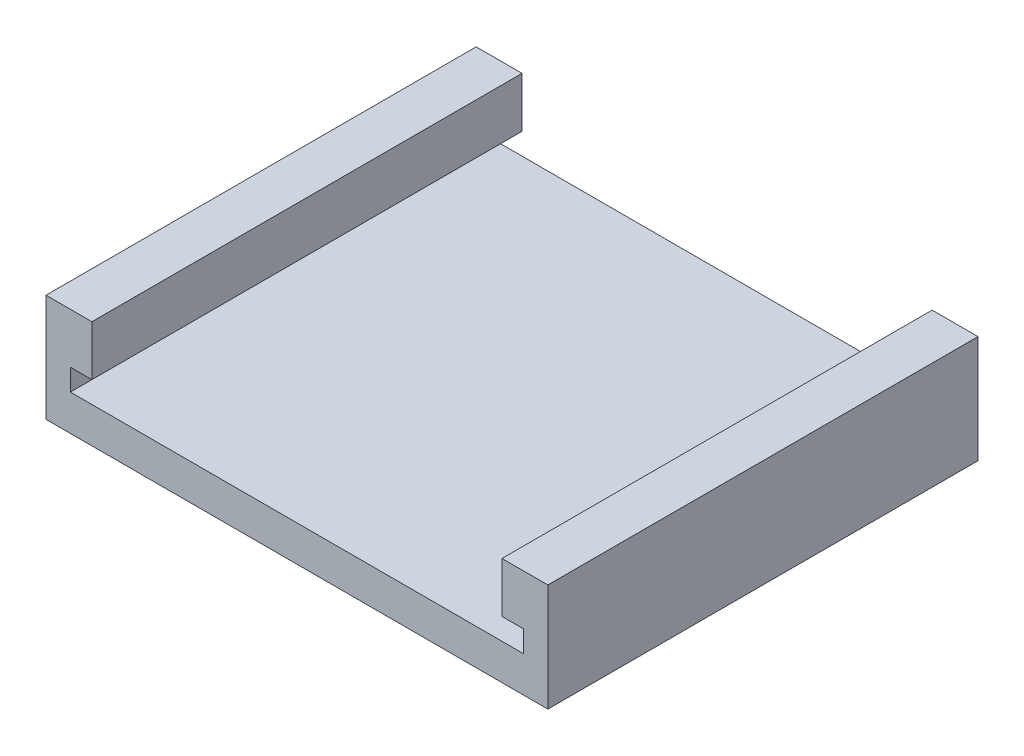
ISO-10303-21;
HEADER;
FILE_DESCRIPTION(('STEP AP214'),'2;1');
FILE_NAME('part.step','',(''),(''),'','','');
FILE_SCHEMA(('AUTOMOTIVE_DESIGN { 1 0 10303 214 1 1 1 1 }'));
ENDSEC;
DATA;
#1=APPLICATION_CONTEXT('core data for automotive mechanical design processes');
#2=APPLICATION_PROTOCOL_DEFINITION('international standard','automotive_design',2000,#1);
#3=PRODUCT_CONTEXT('',#1,'mechanical');
#4=PRODUCT('Part','Part','',(#3));
#5=PRODUCT_RELATED_PRODUCT_CATEGORY('part','',(#4));
#6=PRODUCT_DEFINITION_FORMATION('','',#4);
#7=PRODUCT_DEFINITION_CONTEXT('part definition',#1,'design');
#8=PRODUCT_DEFINITION('design','',#6,#7);
#9=PRODUCT_DEFINITION_SHAPE('','',#8);
#10=(LENGTH_UNIT() NAMED_UNIT(*) SI_UNIT(.MILLI.,.METRE.));
#11=(NAMED_UNIT(*) PLANE_ANGLE_UNIT() SI_UNIT($,.RADIAN.));
#12=(NAMED_UNIT(*) SI_UNIT($,.STERADIAN.) SOLID_ANGLE_UNIT());
#13=UNCERTAINTY_MEASURE_WITH_UNIT(LENGTH_MEASURE(1.E-05),#10,'distance_accuracy_value','');
#14=(GEOMETRIC_REPRESENTATION_CONTEXT(3) GLOBAL_UNCERTAINTY_ASSIGNED_CONTEXT((#13)) GLOBAL_UNIT_ASSIGNED_CONTEXT((#10,
#11,#12)) REPRESENTATION_CONTEXT('',''));
#15=CARTESIAN_POINT('',(0.,0.,0.));
#16=DIRECTION('',(0.,0.,1.));
#17=DIRECTION('',(1.,0.,0.));
#18=AXIS2_PLACEMENT_3D('',#15,#16,#17);
#19=CARTESIAN_POINT('',(31.6,15.,0.));
#20=DIRECTION('',(1.,0.,0.));
#21=DIRECTION('',(0.,0.,-1.));
#22=AXIS2_PLACEMENT_3D('',#19,#20,#21);
#23=PLANE('',#22);
#24=DIRECTION('',(0.,0.,1.));
#25=VECTOR('',#24,1.);
#26=CARTESIAN_POINT('',(31.6,8.,-30.));
#27=LINE('',#26,#25);
#28=CARTESIAN_POINT('',(31.6,8.,-30.));
#29=VERTEX_POINT('',#28);
#30=CARTESIAN_POINT('',(31.6,8.,30.));
#31=VERTEX_POINT('',#30);
#32=EDGE_CURVE('E144',#29,#31,#27,.T.);
#33=ORIENTED_EDGE('',*,*,#32,.F.);
#34=DIRECTION('',(0.,-1.,0.));
#35=VECTOR('',#34,1.);
#36=CARTESIAN_POINT('',(31.6,15.,-30.));
#37=LINE('',#36,#35);
#38=CARTESIAN_POINT('',(31.6,5.,-30.));
#39=VERTEX_POINT('',#38);
#40=EDGE_CURVE('E149',#29,#39,#37,.T.);
#41=ORIENTED_EDGE('',*,*,#40,.T.);
#42=DIRECTION('',(0.,0.,1.));
#43=VECTOR('',#42,1.);
#44=CARTESIAN_POINT('',(31.6,5.,0.));
#45=LINE('',#44,#43);
#46=CARTESIAN_POINT('',(31.6,5.,30.));
#47=VERTEX_POINT('',#46);
#48=EDGE_CURVE('E172',#39,#47,#45,.T.);
#49=ORIENTED_EDGE('',*,*,#48,.T.);
#50=DIRECTION('',(0.,-1.,0.));
#51=VECTOR('',#50,1.);
#52=CARTESIAN_POINT('',(31.6,15.,30.));
#53=LINE('',#52,#51);
#54=EDGE_CURVE('E181',#31,#47,#53,.T.);
#55=ORIENTED_EDGE('',*,*,#54,.F.);
#56=EDGE_LOOP('',(#33,#41,#49,#55));
#57=FACE_BOUND('',#56,.T.);
#58=ADVANCED_FACE('F37',(#57),#23,.F.);
#59=CARTESIAN_POINT('',(-31.6,15.,0.));
#60=DIRECTION('',(1.,0.,0.));
#61=DIRECTION('',(0.,0.,-1.));
#62=AXIS2_PLACEMENT_3D('',#59,#60,#61);
#63=PLANE('',#62);
#64=DIRECTION('',(0.,-1.,0.));
#65=VECTOR('',#64,1.);
#66=CARTESIAN_POINT('',(-31.6,15.,-30.));
#67=LINE('',#66,#65);
#68=CARTESIAN_POINT('',(-31.6,8.,-30.));
#69=VERTEX_POINT('',#68);
#70=CARTESIAN_POINT('',(-31.6,5.,-30.));
#71=VERTEX_POINT('',#70);
#72=EDGE_CURVE('E57',#69,#71,#67,.T.);
#73=ORIENTED_EDGE('',*,*,#72,.F.);
#74=DIRECTION('',(0.,0.,-1.));
#75=VECTOR('',#74,1.);
#76=CARTESIAN_POINT('',(-31.6,8.,30.));
#77=LINE('',#76,#75);
#78=CARTESIAN_POINT('',(-31.6,8.,30.));
#79=VERTEX_POINT('',#78);
#80=EDGE_CURVE('E52',#79,#69,#77,.T.);
#81=ORIENTED_EDGE('',*,*,#80,.F.);
#82=DIRECTION('',(0.,-1.,0.));
#83=VECTOR('',#82,1.);
#84=CARTESIAN_POINT('',(-31.6,15.,30.));
#85=LINE('',#84,#83);
#86=CARTESIAN_POINT('',(-31.6,5.,30.));
#87=VERTEX_POINT('',#86);
#88=EDGE_CURVE('E195',#79,#87,#85,.T.);
#89=ORIENTED_EDGE('',*,*,#88,.T.);
#90=DIRECTION('',(0.,0.,1.));
#91=VECTOR('',#90,1.);
#92=CARTESIAN_POINT('',(-31.6,5.,0.));
#93=LINE('',#92,#91);
#94=EDGE_CURVE('E186',#71,#87,#93,.T.);
#95=ORIENTED_EDGE('',*,*,#94,.F.);
#96=EDGE_LOOP('',(#73,#81,#89,#95));
#97=FACE_BOUND('',#96,.T.);
#98=ADVANCED_FACE('F256',(#97),#63,.T.);
#99=CARTESIAN_POINT('',(0.,5.,0.));
#100=DIRECTION('',(0.,1.,0.));
#101=DIRECTION('',(0.,0.,1.));
#102=AXIS2_PLACEMENT_3D('',#99,#100,#101);
#103=PLANE('',#102);
#104=DIRECTION('',(1.,0.,0.));
#105=VECTOR('',#104,1.);
#106=CARTESIAN_POINT('',(35.,5.,30.));
#107=LINE('',#106,#105);
#108=EDGE_CURVE('E201',#87,#47,#107,.T.);
#109=ORIENTED_EDGE('',*,*,#108,.T.);
#110=ORIENTED_EDGE('',*,*,#48,.F.);
#111=DIRECTION('',(-1.,0.,0.));
#112=VECTOR('',#111,1.);
#113=CARTESIAN_POINT('',(35.,5.,-30.));
#114=LINE('',#113,#112);
#115=EDGE_CURVE('E204',#39,#71,#114,.T.);
#116=ORIENTED_EDGE('',*,*,#115,.T.);
#117=ORIENTED_EDGE('',*,*,#94,.T.);
#118=EDGE_LOOP('',(#109,#110,#116,#117));
#119=FACE_BOUND('',#118,.T.);
#120=ADVANCED_FACE('F262',(#119),#103,.T.);
#121=CARTESIAN_POINT('',(-35.,5.,30.));
#122=DIRECTION('',(1.,0.,0.));
#123=DIRECTION('',(0.,0.,-1.));
#124=AXIS2_PLACEMENT_3D('',#121,#122,#123);
#125=PLANE('',#124);
#126=DIRECTION('',(0.,0.,1.));
#127=VECTOR('',#126,1.);
#128=CARTESIAN_POINT('',(-35.,0.,30.));
#129=LINE('',#128,#127);
#130=CARTESIAN_POINT('',(-35.,0.,-30.));
#131=VERTEX_POINT('',#130);
#132=CARTESIAN_POINT('',(-35.,0.,30.));
#133=VERTEX_POINT('',#132);
#134=EDGE_CURVE('E200',#131,#133,#129,.T.);
#135=ORIENTED_EDGE('',*,*,#134,.T.);
#136=DIRECTION('',(0.,-1.,0.));
#137=VECTOR('',#136,1.);
#138=CARTESIAN_POINT('',(-35.,5.,30.));
#139=LINE('',#138,#137);
#140=CARTESIAN_POINT('',(-35.,15.,30.));
#141=VERTEX_POINT('',#140);
#142=EDGE_CURVE('E11',#141,#133,#139,.T.);
#143=ORIENTED_EDGE('',*,*,#142,.F.);
#144=DIRECTION('',(0.,0.,1.));
#145=VECTOR('',#144,1.);
#146=CARTESIAN_POINT('',(-35.,15.,0.));
#147=LINE('',#146,#145);
#148=CARTESIAN_POINT('',(-35.,15.,-30.));
#149=VERTEX_POINT('',#148);
#150=EDGE_CURVE('E190',#149,#141,#147,.T.);
#151=ORIENTED_EDGE('',*,*,#150,.F.);
#152=DIRECTION('',(0.,-1.,0.));
#153=VECTOR('',#152,1.);
#154=CARTESIAN_POINT('',(-35.,5.,-30.));
#155=LINE('',#154,#153);
#156=EDGE_CURVE('E208',#149,#131,#155,.T.);
#157=ORIENTED_EDGE('',*,*,#156,.T.);
#158=EDGE_LOOP('',(#135,#143,#151,#157));
#159=FACE_BOUND('',#158,.T.);
#160=ADVANCED_FACE('F39',(#159),#125,.F.);
#161=CARTESIAN_POINT('',(35.,5.,30.));
#162=DIRECTION('',(0.,0.,-1.));
#163=DIRECTION('',(-1.,0.,0.));
#164=AXIS2_PLACEMENT_3D('',#161,#162,#163);
#165=PLANE('',#164);
#166=DIRECTION('',(1.,0.,0.));
#167=VECTOR('',#166,1.);
#168=CARTESIAN_POINT('',(35.,0.,30.));
#169=LINE('',#168,#167);
#170=CARTESIAN_POINT('',(35.,0.,30.));
#171=VERTEX_POINT('',#170);
#172=EDGE_CURVE('E211',#133,#171,#169,.T.);
#173=ORIENTED_EDGE('',*,*,#172,.T.);
#174=DIRECTION('',(0.,-1.,0.));
#175=VECTOR('',#174,1.);
#176=CARTESIAN_POINT('',(35.,5.,30.));
#177=LINE('',#176,#175);
#178=CARTESIAN_POINT('',(35.,15.,30.));
#179=VERTEX_POINT('',#178);
#180=EDGE_CURVE('E45',#179,#171,#177,.T.);
#181=ORIENTED_EDGE('',*,*,#180,.F.);
#182=DIRECTION('',(1.,0.,0.));
#183=VECTOR('',#182,1.);
#184=CARTESIAN_POINT('',(0.,15.,30.));
#185=LINE('',#184,#183);
#186=CARTESIAN_POINT('',(28.6,15.,30.));
#187=VERTEX_POINT('',#186);
#188=EDGE_CURVE('E175',#187,#179,#185,.T.);
#189=ORIENTED_EDGE('',*,*,#188,.F.);
#190=DIRECTION('',(0.,1.,0.));
#191=VECTOR('',#190,1.);
#192=CARTESIAN_POINT('',(28.6,15.,30.));
#193=LINE('',#192,#191);
#194=CARTESIAN_POINT('',(28.6,8.,30.));
#195=VERTEX_POINT('',#194);
#196=EDGE_CURVE('E134',#195,#187,#193,.T.);
#197=ORIENTED_EDGE('',*,*,#196,.F.);
#198=DIRECTION('',(1.,0.,0.));
#199=VECTOR('',#198,1.);
#200=CARTESIAN_POINT('',(28.6,8.,30.));
#201=LINE('',#200,#199);
#202=EDGE_CURVE('E130',#195,#31,#201,.T.);
#203=ORIENTED_EDGE('',*,*,#202,.T.);
#204=ORIENTED_EDGE('',*,*,#54,.T.);
#205=ORIENTED_EDGE('',*,*,#108,.F.);
#206=ORIENTED_EDGE('',*,*,#88,.F.);
#207=DIRECTION('',(-1.,0.,0.));
#208=VECTOR('',#207,1.);
#209=CARTESIAN_POINT('',(-28.6,8.,30.));
#210=LINE('',#209,#208);
#211=CARTESIAN_POINT('',(-28.6,8.,30.));
#212=VERTEX_POINT('',#211);
#213=EDGE_CURVE('E169',#212,#79,#210,.T.);
#214=ORIENTED_EDGE('',*,*,#213,.F.);
#215=DIRECTION('',(0.,-1.,0.));
#216=VECTOR('',#215,1.);
#217=CARTESIAN_POINT('',(-28.6,15.,30.));
#218=LINE('',#217,#216);
#219=CARTESIAN_POINT('',(-28.6,15.,30.));
#220=VERTEX_POINT('',#219);
#221=EDGE_CURVE('E151',#220,#212,#218,.T.);
#222=ORIENTED_EDGE('',*,*,#221,.F.);
#223=DIRECTION('',(1.,0.,0.));
#224=VECTOR('',#223,1.);
#225=CARTESIAN_POINT('',(0.,15.,30.));
#226=LINE('',#225,#224);
#227=EDGE_CURVE('E193',#141,#220,#226,.T.);
#228=ORIENTED_EDGE('',*,*,#227,.F.);
#229=ORIENTED_EDGE('',*,*,#142,.T.);
#230=EDGE_LOOP('',(#173,#181,#189,#197,#203,#204,#205,#206,#214,#222,#228,#229));
#231=FACE_BOUND('',#230,.T.);
#232=ADVANCED_FACE('F237',(#231),#165,.F.);
#233=CARTESIAN_POINT('',(35.,5.,30.));
#234=DIRECTION('',(-1.,0.,0.));
#235=DIRECTION('',(0.,0.,1.));
#236=AXIS2_PLACEMENT_3D('',#233,#234,#235);
#237=PLANE('',#236);
#238=DIRECTION('',(0.,0.,-1.));
#239=VECTOR('',#238,1.);
#240=CARTESIAN_POINT('',(35.,0.,30.));
#241=LINE('',#240,#239);
#242=CARTESIAN_POINT('',(35.,0.,-30.));
#243=VERTEX_POINT('',#242);
#244=EDGE_CURVE('E213',#171,#243,#241,.T.);
#245=ORIENTED_EDGE('',*,*,#244,.T.);
#246=DIRECTION('',(0.,-1.,0.));
#247=VECTOR('',#246,1.);
#248=CARTESIAN_POINT('',(35.,5.,-30.));
#249=LINE('',#248,#247);
#250=CARTESIAN_POINT('',(35.,15.,-30.));
#251=VERTEX_POINT('',#250);
#252=EDGE_CURVE('E218',#251,#243,#249,.T.);
#253=ORIENTED_EDGE('',*,*,#252,.F.);
#254=DIRECTION('',(0.,0.,-1.));
#255=VECTOR('',#254,1.);
#256=CARTESIAN_POINT('',(35.,15.,0.));
#257=LINE('',#256,#255);
#258=EDGE_CURVE('E178',#179,#251,#257,.T.);
#259=ORIENTED_EDGE('',*,*,#258,.F.);
#260=ORIENTED_EDGE('',*,*,#180,.T.);
#261=EDGE_LOOP('',(#245,#253,#259,#260));
#262=FACE_BOUND('',#261,.T.);
#263=ADVANCED_FACE('F224',(#262),#237,.F.);
#264=CARTESIAN_POINT('',(35.,5.,-30.));
#265=DIRECTION('',(0.,0.,1.));
#266=DIRECTION('',(1.,0.,0.));
#267=AXIS2_PLACEMENT_3D('',#264,#265,#266);
#268=PLANE('',#267);
#269=DIRECTION('',(-1.,0.,0.));
#270=VECTOR('',#269,1.);
#271=CARTESIAN_POINT('',(35.,0.,-30.));
#272=LINE('',#271,#270);
#273=EDGE_CURVE('E205',#243,#131,#272,.T.);
#274=ORIENTED_EDGE('',*,*,#273,.T.);
#275=ORIENTED_EDGE('',*,*,#156,.F.);
#276=DIRECTION('',(-1.,0.,0.));
#277=VECTOR('',#276,1.);
#278=CARTESIAN_POINT('',(0.,15.,-30.));
#279=LINE('',#278,#277);
#280=CARTESIAN_POINT('',(-28.6,15.,-30.));
#281=VERTEX_POINT('',#280);
#282=EDGE_CURVE('E187',#281,#149,#279,.T.);
#283=ORIENTED_EDGE('',*,*,#282,.F.);
#284=DIRECTION('',(0.,1.,0.));
#285=VECTOR('',#284,1.);
#286=CARTESIAN_POINT('',(-28.6,15.,-30.));
#287=LINE('',#286,#285);
#288=CARTESIAN_POINT('',(-28.6,8.,-30.));
#289=VERTEX_POINT('',#288);
#290=EDGE_CURVE('E160',#289,#281,#287,.T.);
#291=ORIENTED_EDGE('',*,*,#290,.F.);
#292=DIRECTION('',(-1.,0.,0.));
#293=VECTOR('',#292,1.);
#294=CARTESIAN_POINT('',(-28.6,8.,-30.));
#295=LINE('',#294,#293);
#296=EDGE_CURVE('E165',#289,#69,#295,.T.);
#297=ORIENTED_EDGE('',*,*,#296,.T.);
#298=ORIENTED_EDGE('',*,*,#72,.T.);
#299=ORIENTED_EDGE('',*,*,#115,.F.);
#300=ORIENTED_EDGE('',*,*,#40,.F.);
#301=DIRECTION('',(1.,0.,0.));
#302=VECTOR('',#301,1.);
#303=CARTESIAN_POINT('',(28.6,8.,-30.));
#304=LINE('',#303,#302);
#305=CARTESIAN_POINT('',(28.6,8.,-30.));
#306=VERTEX_POINT('',#305);
#307=EDGE_CURVE('E127',#306,#29,#304,.T.);
#308=ORIENTED_EDGE('',*,*,#307,.F.);
#309=DIRECTION('',(0.,-1.,0.));
#310=VECTOR('',#309,1.);
#311=CARTESIAN_POINT('',(28.6,15.,-30.));
#312=LINE('',#311,#310);
#313=CARTESIAN_POINT('',(28.6,15.,-30.));
#314=VERTEX_POINT('',#313);
#315=EDGE_CURVE('E135',#314,#306,#312,.T.);
#316=ORIENTED_EDGE('',*,*,#315,.F.);
#317=DIRECTION('',(-1.,0.,0.));
#318=VECTOR('',#317,1.);
#319=CARTESIAN_POINT('',(0.,15.,-30.));
#320=LINE('',#319,#318);
#321=EDGE_CURVE('E173',#251,#314,#320,.T.);
#322=ORIENTED_EDGE('',*,*,#321,.F.);
#323=ORIENTED_EDGE('',*,*,#252,.T.);
#324=EDGE_LOOP('',(#274,#275,#283,#291,#297,#298,#299,#300,#308,#316,#322,#323));
#325=FACE_BOUND('',#324,.T.);
#326=ADVANCED_FACE('F147',(#325),#268,.F.);
#327=CARTESIAN_POINT('',(0.,0.,0.));
#328=DIRECTION('',(0.,1.,0.));
#329=DIRECTION('',(0.,0.,1.));
#330=AXIS2_PLACEMENT_3D('',#327,#328,#329);
#331=PLANE('',#330);
#332=ORIENTED_EDGE('',*,*,#134,.F.);
#333=ORIENTED_EDGE('',*,*,#273,.F.);
#334=ORIENTED_EDGE('',*,*,#244,.F.);
#335=ORIENTED_EDGE('',*,*,#172,.F.);
#336=EDGE_LOOP('',(#332,#333,#334,#335));
#337=FACE_BOUND('',#336,.T.);
#338=ADVANCED_FACE('F229',(#337),#331,.F.);
#339=CARTESIAN_POINT('',(0.,15.,0.));
#340=DIRECTION('',(0.,1.,0.));
#341=DIRECTION('',(0.,0.,1.));
#342=AXIS2_PLACEMENT_3D('',#339,#340,#341);
#343=PLANE('',#342);
#344=ORIENTED_EDGE('',*,*,#227,.T.);
#345=DIRECTION('',(0.,0.,1.));
#346=VECTOR('',#345,1.);
#347=CARTESIAN_POINT('',(-28.6,15.,30.));
#348=LINE('',#347,#346);
#349=EDGE_CURVE('E163',#281,#220,#348,.T.);
#350=ORIENTED_EDGE('',*,*,#349,.F.);
#351=ORIENTED_EDGE('',*,*,#282,.T.);
#352=ORIENTED_EDGE('',*,*,#150,.T.);
#353=EDGE_LOOP('',(#344,#350,#351,#352));
#354=FACE_BOUND('',#353,.T.);
#355=ADVANCED_FACE('F234',(#354),#343,.T.);
#356=CARTESIAN_POINT('',(0.,15.,0.));
#357=DIRECTION('',(0.,1.,0.));
#358=DIRECTION('',(0.,0.,1.));
#359=AXIS2_PLACEMENT_3D('',#356,#357,#358);
#360=PLANE('',#359);
#361=ORIENTED_EDGE('',*,*,#321,.T.);
#362=DIRECTION('',(0.,0.,-1.));
#363=VECTOR('',#362,1.);
#364=CARTESIAN_POINT('',(28.6,15.,-30.));
#365=LINE('',#364,#363);
#366=EDGE_CURVE('E141',#187,#314,#365,.T.);
#367=ORIENTED_EDGE('',*,*,#366,.F.);
#368=ORIENTED_EDGE('',*,*,#188,.T.);
#369=ORIENTED_EDGE('',*,*,#258,.T.);
#370=EDGE_LOOP('',(#361,#367,#368,#369));
#371=FACE_BOUND('',#370,.T.);
#372=ADVANCED_FACE('F246',(#371),#360,.T.);
#373=CARTESIAN_POINT('',(-28.6,8.,30.));
#374=DIRECTION('',(0.,1.,0.));
#375=DIRECTION('',(0.,0.,1.));
#376=AXIS2_PLACEMENT_3D('',#373,#374,#375);
#377=PLANE('',#376);
#378=ORIENTED_EDGE('',*,*,#80,.T.);
#379=ORIENTED_EDGE('',*,*,#296,.F.);
#380=DIRECTION('',(0.,0.,-1.));
#381=VECTOR('',#380,1.);
#382=CARTESIAN_POINT('',(-28.6,8.,30.));
#383=LINE('',#382,#381);
#384=EDGE_CURVE('E158',#212,#289,#383,.T.);
#385=ORIENTED_EDGE('',*,*,#384,.F.);
#386=ORIENTED_EDGE('',*,*,#213,.T.);
#387=EDGE_LOOP('',(#378,#379,#385,#386));
#388=FACE_BOUND('',#387,.T.);
#389=ADVANCED_FACE('F244',(#388),#377,.F.);
#390=CARTESIAN_POINT('',(-28.6,0.,0.));
#391=DIRECTION('',(1.,0.,0.));
#392=DIRECTION('',(0.,0.,-1.));
#393=AXIS2_PLACEMENT_3D('',#390,#391,#392);
#394=PLANE('',#393);
#395=ORIENTED_EDGE('',*,*,#221,.T.);
#396=ORIENTED_EDGE('',*,*,#384,.T.);
#397=ORIENTED_EDGE('',*,*,#290,.T.);
#398=ORIENTED_EDGE('',*,*,#349,.T.);
#399=EDGE_LOOP('',(#395,#396,#397,#398));
#400=FACE_BOUND('',#399,.T.);
#401=ADVANCED_FACE('F240',(#400),#394,.T.);
#402=CARTESIAN_POINT('',(28.6,8.,-30.));
#403=DIRECTION('',(0.,1.,0.));
#404=DIRECTION('',(0.,0.,1.));
#405=AXIS2_PLACEMENT_3D('',#402,#403,#404);
#406=PLANE('',#405);
#407=ORIENTED_EDGE('',*,*,#32,.T.);
#408=ORIENTED_EDGE('',*,*,#202,.F.);
#409=DIRECTION('',(0.,0.,1.));
#410=VECTOR('',#409,1.);
#411=CARTESIAN_POINT('',(28.6,8.,-30.));
#412=LINE('',#411,#410);
#413=EDGE_CURVE('E123',#306,#195,#412,.T.);
#414=ORIENTED_EDGE('',*,*,#413,.F.);
#415=ORIENTED_EDGE('',*,*,#307,.T.);
#416=EDGE_LOOP('',(#407,#408,#414,#415));
#417=FACE_BOUND('',#416,.T.);
#418=ADVANCED_FACE('F125',(#417),#406,.F.);
#419=CARTESIAN_POINT('',(28.6,0.,0.));
#420=DIRECTION('',(-1.,0.,0.));
#421=DIRECTION('',(0.,0.,1.));
#422=AXIS2_PLACEMENT_3D('',#419,#420,#421);
#423=PLANE('',#422);
#424=ORIENTED_EDGE('',*,*,#315,.T.);
#425=ORIENTED_EDGE('',*,*,#413,.T.);
#426=ORIENTED_EDGE('',*,*,#196,.T.);
#427=ORIENTED_EDGE('',*,*,#366,.T.);
#428=EDGE_LOOP('',(#424,#425,#426,#427));
#429=FACE_BOUND('',#428,.T.);
#430=ADVANCED_FACE('F139',(#429),#423,.T.);
#431=CLOSED_SHELL('',(#58,#98,#120,#160,#232,#263,#326,#338,#355,#372,#389,#401,#418,#430));
#432=MANIFOLD_SOLID_BREP('B2',#431);
#433=ADVANCED_BREP_SHAPE_REPRESENTATION('',(#18,#432),#14);
#434=SHAPE_DEFINITION_REPRESENTATION(#9,#433);
ENDSEC;
END-ISO-10303-21;
